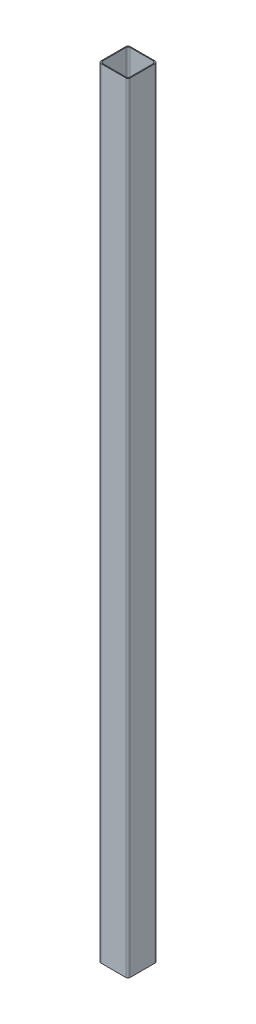
ISO-10303-21;
HEADER;
FILE_DESCRIPTION(('STEP AP214'),'2;1');
FILE_NAME('part.step','',(''),(''),'','','');
FILE_SCHEMA(('AUTOMOTIVE_DESIGN { 1 0 10303 214 1 1 1 1 }'));
ENDSEC;
DATA;
#1=APPLICATION_CONTEXT('core data for automotive mechanical design processes');
#2=APPLICATION_PROTOCOL_DEFINITION('international standard','automotive_design',2000,#1);
#3=PRODUCT_CONTEXT('',#1,'mechanical');
#4=PRODUCT('Part','Part','',(#3));
#5=PRODUCT_RELATED_PRODUCT_CATEGORY('part','',(#4));
#6=PRODUCT_DEFINITION_FORMATION('','',#4);
#7=PRODUCT_DEFINITION_CONTEXT('part definition',#1,'design');
#8=PRODUCT_DEFINITION('design','',#6,#7);
#9=PRODUCT_DEFINITION_SHAPE('','',#8);
#10=(LENGTH_UNIT() NAMED_UNIT(*) SI_UNIT(.MILLI.,.METRE.));
#11=(NAMED_UNIT(*) PLANE_ANGLE_UNIT() SI_UNIT($,.RADIAN.));
#12=(NAMED_UNIT(*) SI_UNIT($,.STERADIAN.) SOLID_ANGLE_UNIT());
#13=UNCERTAINTY_MEASURE_WITH_UNIT(LENGTH_MEASURE(1.E-05),#10,'distance_accuracy_value','');
#14=(GEOMETRIC_REPRESENTATION_CONTEXT(3) GLOBAL_UNCERTAINTY_ASSIGNED_CONTEXT((#13)) GLOBAL_UNIT_ASSIGNED_CONTEXT((#10,
#11,#12)) REPRESENTATION_CONTEXT('',''));
#15=CARTESIAN_POINT('',(0.,0.,0.));
#16=DIRECTION('',(0.,0.,1.));
#17=DIRECTION('',(1.,0.,0.));
#18=AXIS2_PLACEMENT_3D('',#15,#16,#17);
#19=CARTESIAN_POINT('',(0.,530.,0.));
#20=DIRECTION('',(0.,1.,0.));
#21=DIRECTION('',(0.,0.,1.));
#22=AXIS2_PLACEMENT_3D('',#19,#20,#21);
#23=PLANE('',#22);
#24=DIRECTION('',(-1.,0.,0.));
#25=VECTOR('',#24,1.);
#26=CARTESIAN_POINT('',(20.,530.,-20.));
#27=LINE('',#26,#25);
#28=CARTESIAN_POINT('',(17.,530.,-20.));
#29=VERTEX_POINT('',#28);
#30=CARTESIAN_POINT('',(-17.,530.,-20.));
#31=VERTEX_POINT('',#30);
#32=EDGE_CURVE('E183',#29,#31,#27,.T.);
#33=ORIENTED_EDGE('',*,*,#32,.T.);
#34=CARTESIAN_POINT('',(-17.,530.,-17.));
#35=DIRECTION('',(0.,1.,0.));
#36=DIRECTION('',(0.,0.,1.));
#37=AXIS2_PLACEMENT_3D('',#34,#35,#36);
#38=CIRCLE('',#37,3.);
#39=CARTESIAN_POINT('',(-20.,530.,-17.));
#40=VERTEX_POINT('',#39);
#41=EDGE_CURVE('E203',#31,#40,#38,.T.);
#42=ORIENTED_EDGE('',*,*,#41,.T.);
#43=DIRECTION('',(0.,0.,1.));
#44=VECTOR('',#43,1.);
#45=CARTESIAN_POINT('',(-20.,530.,20.));
#46=LINE('',#45,#44);
#47=CARTESIAN_POINT('',(-20.,530.,17.));
#48=VERTEX_POINT('',#47);
#49=EDGE_CURVE('E165',#40,#48,#46,.T.);
#50=ORIENTED_EDGE('',*,*,#49,.T.);
#51=CARTESIAN_POINT('',(-17.,530.,17.));
#52=DIRECTION('',(0.,1.,0.));
#53=DIRECTION('',(0.,0.,1.));
#54=AXIS2_PLACEMENT_3D('',#51,#52,#53);
#55=CIRCLE('',#54,3.);
#56=CARTESIAN_POINT('',(-17.,530.,20.));
#57=VERTEX_POINT('',#56);
#58=EDGE_CURVE('E199',#48,#57,#55,.T.);
#59=ORIENTED_EDGE('',*,*,#58,.T.);
#60=DIRECTION('',(1.,0.,0.));
#61=VECTOR('',#60,1.);
#62=CARTESIAN_POINT('',(20.,530.,20.));
#63=LINE('',#62,#61);
#64=CARTESIAN_POINT('',(17.,530.,20.));
#65=VERTEX_POINT('',#64);
#66=EDGE_CURVE('E275',#57,#65,#63,.T.);
#67=ORIENTED_EDGE('',*,*,#66,.T.);
#68=CARTESIAN_POINT('',(17.,530.,17.));
#69=DIRECTION('',(0.,1.,0.));
#70=DIRECTION('',(0.,0.,1.));
#71=AXIS2_PLACEMENT_3D('',#68,#69,#70);
#72=CIRCLE('',#71,3.);
#73=CARTESIAN_POINT('',(20.,530.,17.));
#74=VERTEX_POINT('',#73);
#75=EDGE_CURVE('E197',#65,#74,#72,.T.);
#76=ORIENTED_EDGE('',*,*,#75,.T.);
#77=DIRECTION('',(0.,0.,-1.));
#78=VECTOR('',#77,1.);
#79=CARTESIAN_POINT('',(20.,530.,20.));
#80=LINE('',#79,#78);
#81=CARTESIAN_POINT('',(20.,530.,-17.));
#82=VERTEX_POINT('',#81);
#83=EDGE_CURVE('E277',#74,#82,#80,.T.);
#84=ORIENTED_EDGE('',*,*,#83,.T.);
#85=CARTESIAN_POINT('',(17.,530.,-17.));
#86=DIRECTION('',(0.,1.,0.));
#87=DIRECTION('',(0.,0.,1.));
#88=AXIS2_PLACEMENT_3D('',#85,#86,#87);
#89=CIRCLE('',#88,3.);
#90=EDGE_CURVE('E201',#82,#29,#89,.T.);
#91=ORIENTED_EDGE('',*,*,#90,.T.);
#92=EDGE_LOOP('',(#33,#42,#50,#59,#67,#76,#84,#91));
#93=FACE_BOUND('',#92,.T.);
#94=DIRECTION('',(0.,0.,-1.));
#95=VECTOR('',#94,1.);
#96=CARTESIAN_POINT('',(18.8,530.,18.8));
#97=LINE('',#96,#95);
#98=CARTESIAN_POINT('',(18.8,530.,15.8));
#99=VERTEX_POINT('',#98);
#100=CARTESIAN_POINT('',(18.8,530.,-15.8));
#101=VERTEX_POINT('',#100);
#102=EDGE_CURVE('E261',#99,#101,#97,.T.);
#103=ORIENTED_EDGE('',*,*,#102,.F.);
#104=CARTESIAN_POINT('',(15.8,530.,15.8));
#105=DIRECTION('',(0.,1.,0.));
#106=DIRECTION('',(0.,0.,1.));
#107=AXIS2_PLACEMENT_3D('',#104,#105,#106);
#108=CIRCLE('',#107,3.);
#109=CARTESIAN_POINT('',(15.8,530.,18.8));
#110=VERTEX_POINT('',#109);
#111=EDGE_CURVE('E240',#99,#110,#108,.F.);
#112=ORIENTED_EDGE('',*,*,#111,.T.);
#113=DIRECTION('',(1.,0.,0.));
#114=VECTOR('',#113,1.);
#115=CARTESIAN_POINT('',(18.8,530.,18.8));
#116=LINE('',#115,#114);
#117=CARTESIAN_POINT('',(-15.8,530.,18.8));
#118=VERTEX_POINT('',#117);
#119=EDGE_CURVE('E256',#118,#110,#116,.T.);
#120=ORIENTED_EDGE('',*,*,#119,.F.);
#121=CARTESIAN_POINT('',(-15.8,530.,15.8));
#122=DIRECTION('',(0.,1.,0.));
#123=DIRECTION('',(0.,0.,1.));
#124=AXIS2_PLACEMENT_3D('',#121,#122,#123);
#125=CIRCLE('',#124,3.);
#126=CARTESIAN_POINT('',(-18.8,530.,15.8));
#127=VERTEX_POINT('',#126);
#128=EDGE_CURVE('E244',#118,#127,#125,.F.);
#129=ORIENTED_EDGE('',*,*,#128,.T.);
#130=DIRECTION('',(0.,0.,1.));
#131=VECTOR('',#130,1.);
#132=CARTESIAN_POINT('',(-18.8,530.,18.8));
#133=LINE('',#132,#131);
#134=CARTESIAN_POINT('',(-18.8,530.,-15.8));
#135=VERTEX_POINT('',#134);
#136=EDGE_CURVE('E174',#135,#127,#133,.T.);
#137=ORIENTED_EDGE('',*,*,#136,.F.);
#138=CARTESIAN_POINT('',(-15.8,530.,-15.8));
#139=DIRECTION('',(0.,1.,0.));
#140=DIRECTION('',(0.,0.,1.));
#141=AXIS2_PLACEMENT_3D('',#138,#139,#140);
#142=CIRCLE('',#141,3.);
#143=CARTESIAN_POINT('',(-15.8,530.,-18.8));
#144=VERTEX_POINT('',#143);
#145=EDGE_CURVE('E11',#135,#144,#142,.F.);
#146=ORIENTED_EDGE('',*,*,#145,.T.);
#147=DIRECTION('',(-1.,0.,0.));
#148=VECTOR('',#147,1.);
#149=CARTESIAN_POINT('',(18.8,530.,-18.8));
#150=LINE('',#149,#148);
#151=CARTESIAN_POINT('',(15.8,530.,-18.8));
#152=VERTEX_POINT('',#151);
#153=EDGE_CURVE('E180',#152,#144,#150,.T.);
#154=ORIENTED_EDGE('',*,*,#153,.F.);
#155=CARTESIAN_POINT('',(15.8,530.,-15.8));
#156=DIRECTION('',(0.,1.,0.));
#157=DIRECTION('',(0.,0.,1.));
#158=AXIS2_PLACEMENT_3D('',#155,#156,#157);
#159=CIRCLE('',#158,3.);
#160=EDGE_CURVE('E236',#152,#101,#159,.F.);
#161=ORIENTED_EDGE('',*,*,#160,.T.);
#162=EDGE_LOOP('',(#103,#112,#120,#129,#137,#146,#154,#161));
#163=FACE_BOUND('',#162,.T.);
#164=ADVANCED_FACE('F32',(#93,#163),#23,.T.);
#165=CARTESIAN_POINT('',(0.,-530.,0.));
#166=DIRECTION('',(0.,1.,0.));
#167=DIRECTION('',(0.,0.,1.));
#168=AXIS2_PLACEMENT_3D('',#165,#166,#167);
#169=PLANE('',#168);
#170=DIRECTION('',(0.,0.,1.));
#171=VECTOR('',#170,1.);
#172=CARTESIAN_POINT('',(-20.,-530.,20.));
#173=LINE('',#172,#171);
#174=CARTESIAN_POINT('',(-20.,-530.,-17.));
#175=VERTEX_POINT('',#174);
#176=CARTESIAN_POINT('',(-20.,-530.,17.));
#177=VERTEX_POINT('',#176);
#178=EDGE_CURVE('E162',#175,#177,#173,.T.);
#179=ORIENTED_EDGE('',*,*,#178,.F.);
#180=CARTESIAN_POINT('',(-17.,-530.,-17.));
#181=DIRECTION('',(0.,1.,0.));
#182=DIRECTION('',(0.,0.,1.));
#183=AXIS2_PLACEMENT_3D('',#180,#181,#182);
#184=CIRCLE('',#183,3.);
#185=CARTESIAN_POINT('',(-17.,-530.,-20.));
#186=VERTEX_POINT('',#185);
#187=EDGE_CURVE('E145',#175,#186,#184,.F.);
#188=ORIENTED_EDGE('',*,*,#187,.T.);
#189=DIRECTION('',(-1.,0.,0.));
#190=VECTOR('',#189,1.);
#191=CARTESIAN_POINT('',(20.,-530.,-20.));
#192=LINE('',#191,#190);
#193=CARTESIAN_POINT('',(17.,-530.,-20.));
#194=VERTEX_POINT('',#193);
#195=EDGE_CURVE('E188',#194,#186,#192,.T.);
#196=ORIENTED_EDGE('',*,*,#195,.F.);
#197=CARTESIAN_POINT('',(17.,-530.,-17.));
#198=DIRECTION('',(0.,1.,0.));
#199=DIRECTION('',(0.,0.,1.));
#200=AXIS2_PLACEMENT_3D('',#197,#198,#199);
#201=CIRCLE('',#200,3.);
#202=CARTESIAN_POINT('',(20.,-530.,-17.));
#203=VERTEX_POINT('',#202);
#204=EDGE_CURVE('E156',#194,#203,#201,.F.);
#205=ORIENTED_EDGE('',*,*,#204,.T.);
#206=DIRECTION('',(0.,0.,-1.));
#207=VECTOR('',#206,1.);
#208=CARTESIAN_POINT('',(20.,-530.,20.));
#209=LINE('',#208,#207);
#210=CARTESIAN_POINT('',(20.,-530.,17.));
#211=VERTEX_POINT('',#210);
#212=EDGE_CURVE('E177',#211,#203,#209,.T.);
#213=ORIENTED_EDGE('',*,*,#212,.F.);
#214=CARTESIAN_POINT('',(17.,-530.,17.));
#215=DIRECTION('',(0.,1.,0.));
#216=DIRECTION('',(0.,0.,1.));
#217=AXIS2_PLACEMENT_3D('',#214,#215,#216);
#218=CIRCLE('',#217,3.);
#219=CARTESIAN_POINT('',(17.,-530.,20.));
#220=VERTEX_POINT('',#219);
#221=EDGE_CURVE('E166',#211,#220,#218,.F.);
#222=ORIENTED_EDGE('',*,*,#221,.T.);
#223=DIRECTION('',(1.,0.,0.));
#224=VECTOR('',#223,1.);
#225=CARTESIAN_POINT('',(20.,-530.,20.));
#226=LINE('',#225,#224);
#227=CARTESIAN_POINT('',(-17.,-530.,20.));
#228=VERTEX_POINT('',#227);
#229=EDGE_CURVE('E173',#228,#220,#226,.T.);
#230=ORIENTED_EDGE('',*,*,#229,.F.);
#231=CARTESIAN_POINT('',(-17.,-530.,17.));
#232=DIRECTION('',(0.,1.,0.));
#233=DIRECTION('',(0.,0.,1.));
#234=AXIS2_PLACEMENT_3D('',#231,#232,#233);
#235=CIRCLE('',#234,3.);
#236=EDGE_CURVE('E172',#228,#177,#235,.F.);
#237=ORIENTED_EDGE('',*,*,#236,.T.);
#238=EDGE_LOOP('',(#179,#188,#196,#205,#213,#222,#230,#237));
#239=FACE_BOUND('',#238,.T.);
#240=DIRECTION('',(0.,0.,1.));
#241=VECTOR('',#240,1.);
#242=CARTESIAN_POINT('',(-18.8,-530.,18.8));
#243=LINE('',#242,#241);
#244=CARTESIAN_POINT('',(-18.8,-530.,-15.8));
#245=VERTEX_POINT('',#244);
#246=CARTESIAN_POINT('',(-18.8,-530.,15.8));
#247=VERTEX_POINT('',#246);
#248=EDGE_CURVE('E248',#245,#247,#243,.T.);
#249=ORIENTED_EDGE('',*,*,#248,.T.);
#250=CARTESIAN_POINT('',(-15.8,-530.,15.8));
#251=DIRECTION('',(0.,1.,0.));
#252=DIRECTION('',(0.,0.,1.));
#253=AXIS2_PLACEMENT_3D('',#250,#251,#252);
#254=CIRCLE('',#253,3.);
#255=CARTESIAN_POINT('',(-15.8,-530.,18.8));
#256=VERTEX_POINT('',#255);
#257=EDGE_CURVE('E242',#247,#256,#254,.T.);
#258=ORIENTED_EDGE('',*,*,#257,.T.);
#259=DIRECTION('',(1.,0.,0.));
#260=VECTOR('',#259,1.);
#261=CARTESIAN_POINT('',(18.8,-530.,18.8));
#262=LINE('',#261,#260);
#263=CARTESIAN_POINT('',(15.8,-530.,18.8));
#264=VERTEX_POINT('',#263);
#265=EDGE_CURVE('E267',#256,#264,#262,.T.);
#266=ORIENTED_EDGE('',*,*,#265,.T.);
#267=CARTESIAN_POINT('',(15.8,-530.,15.8));
#268=DIRECTION('',(0.,1.,0.));
#269=DIRECTION('',(0.,0.,1.));
#270=AXIS2_PLACEMENT_3D('',#267,#268,#269);
#271=CIRCLE('',#270,3.);
#272=CARTESIAN_POINT('',(18.8,-530.,15.8));
#273=VERTEX_POINT('',#272);
#274=EDGE_CURVE('E238',#264,#273,#271,.T.);
#275=ORIENTED_EDGE('',*,*,#274,.T.);
#276=DIRECTION('',(0.,0.,-1.));
#277=VECTOR('',#276,1.);
#278=CARTESIAN_POINT('',(18.8,-530.,18.8));
#279=LINE('',#278,#277);
#280=CARTESIAN_POINT('',(18.8,-530.,-15.8));
#281=VERTEX_POINT('',#280);
#282=EDGE_CURVE('E270',#273,#281,#279,.T.);
#283=ORIENTED_EDGE('',*,*,#282,.T.);
#284=CARTESIAN_POINT('',(15.8,-530.,-15.8));
#285=DIRECTION('',(0.,1.,0.));
#286=DIRECTION('',(0.,0.,1.));
#287=AXIS2_PLACEMENT_3D('',#284,#285,#286);
#288=CIRCLE('',#287,3.);
#289=CARTESIAN_POINT('',(15.8,-530.,-18.8));
#290=VERTEX_POINT('',#289);
#291=EDGE_CURVE('E234',#281,#290,#288,.T.);
#292=ORIENTED_EDGE('',*,*,#291,.T.);
#293=DIRECTION('',(-1.,0.,0.));
#294=VECTOR('',#293,1.);
#295=CARTESIAN_POINT('',(18.8,-530.,-18.8));
#296=LINE('',#295,#294);
#297=CARTESIAN_POINT('',(-15.8,-530.,-18.8));
#298=VERTEX_POINT('',#297);
#299=EDGE_CURVE('E249',#290,#298,#296,.T.);
#300=ORIENTED_EDGE('',*,*,#299,.T.);
#301=CARTESIAN_POINT('',(-15.8,-530.,-15.8));
#302=DIRECTION('',(0.,1.,0.));
#303=DIRECTION('',(0.,0.,1.));
#304=AXIS2_PLACEMENT_3D('',#301,#302,#303);
#305=CIRCLE('',#304,3.);
#306=EDGE_CURVE('E40',#298,#245,#305,.T.);
#307=ORIENTED_EDGE('',*,*,#306,.T.);
#308=EDGE_LOOP('',(#249,#258,#266,#275,#283,#292,#300,#307));
#309=FACE_BOUND('',#308,.T.);
#310=ADVANCED_FACE('F169',(#239,#309),#169,.F.);
#311=CARTESIAN_POINT('',(-20.,530.,20.));
#312=DIRECTION('',(1.,0.,0.));
#313=DIRECTION('',(0.,0.,-1.));
#314=AXIS2_PLACEMENT_3D('',#311,#312,#313);
#315=PLANE('',#314);
#316=ORIENTED_EDGE('',*,*,#49,.F.);
#317=DIRECTION('',(0.,-1.,0.));
#318=VECTOR('',#317,1.);
#319=CARTESIAN_POINT('',(-20.,530.,-17.));
#320=LINE('',#319,#318);
#321=EDGE_CURVE('E149',#40,#175,#320,.T.);
#322=ORIENTED_EDGE('',*,*,#321,.T.);
#323=ORIENTED_EDGE('',*,*,#178,.T.);
#324=DIRECTION('',(0.,-1.,0.));
#325=VECTOR('',#324,1.);
#326=CARTESIAN_POINT('',(-20.,530.,17.));
#327=LINE('',#326,#325);
#328=EDGE_CURVE('E167',#177,#48,#327,.F.);
#329=ORIENTED_EDGE('',*,*,#328,.T.);
#330=EDGE_LOOP('',(#316,#322,#323,#329));
#331=FACE_BOUND('',#330,.T.);
#332=ADVANCED_FACE('F161',(#331),#315,.F.);
#333=CARTESIAN_POINT('',(20.,530.,20.));
#334=DIRECTION('',(0.,0.,-1.));
#335=DIRECTION('',(-1.,0.,0.));
#336=AXIS2_PLACEMENT_3D('',#333,#334,#335);
#337=PLANE('',#336);
#338=ORIENTED_EDGE('',*,*,#66,.F.);
#339=DIRECTION('',(0.,-1.,0.));
#340=VECTOR('',#339,1.);
#341=CARTESIAN_POINT('',(-17.,530.,20.));
#342=LINE('',#341,#340);
#343=EDGE_CURVE('E231',#57,#228,#342,.T.);
#344=ORIENTED_EDGE('',*,*,#343,.T.);
#345=ORIENTED_EDGE('',*,*,#229,.T.);
#346=DIRECTION('',(0.,-1.,0.));
#347=VECTOR('',#346,1.);
#348=CARTESIAN_POINT('',(17.,530.,20.));
#349=LINE('',#348,#347);
#350=EDGE_CURVE('E229',#220,#65,#349,.F.);
#351=ORIENTED_EDGE('',*,*,#350,.T.);
#352=EDGE_LOOP('',(#338,#344,#345,#351));
#353=FACE_BOUND('',#352,.T.);
#354=ADVANCED_FACE('F299',(#353),#337,.F.);
#355=CARTESIAN_POINT('',(20.,530.,20.));
#356=DIRECTION('',(-1.,0.,0.));
#357=DIRECTION('',(0.,0.,1.));
#358=AXIS2_PLACEMENT_3D('',#355,#356,#357);
#359=PLANE('',#358);
#360=ORIENTED_EDGE('',*,*,#212,.T.);
#361=DIRECTION('',(0.,-1.,0.));
#362=VECTOR('',#361,1.);
#363=CARTESIAN_POINT('',(20.,530.,-17.));
#364=LINE('',#363,#362);
#365=EDGE_CURVE('E208',#203,#82,#364,.F.);
#366=ORIENTED_EDGE('',*,*,#365,.T.);
#367=ORIENTED_EDGE('',*,*,#83,.F.);
#368=DIRECTION('',(0.,-1.,0.));
#369=VECTOR('',#368,1.);
#370=CARTESIAN_POINT('',(20.,530.,17.));
#371=LINE('',#370,#369);
#372=EDGE_CURVE('E205',#74,#211,#371,.T.);
#373=ORIENTED_EDGE('',*,*,#372,.T.);
#374=EDGE_LOOP('',(#360,#366,#367,#373));
#375=FACE_BOUND('',#374,.T.);
#376=ADVANCED_FACE('F292',(#375),#359,.F.);
#377=CARTESIAN_POINT('',(20.,530.,-20.));
#378=DIRECTION('',(0.,0.,1.));
#379=DIRECTION('',(1.,0.,0.));
#380=AXIS2_PLACEMENT_3D('',#377,#378,#379);
#381=PLANE('',#380);
#382=ORIENTED_EDGE('',*,*,#195,.T.);
#383=DIRECTION('',(0.,-1.,0.));
#384=VECTOR('',#383,1.);
#385=CARTESIAN_POINT('',(-17.,530.,-20.));
#386=LINE('',#385,#384);
#387=EDGE_CURVE('E150',#186,#31,#386,.F.);
#388=ORIENTED_EDGE('',*,*,#387,.T.);
#389=ORIENTED_EDGE('',*,*,#32,.F.);
#390=DIRECTION('',(0.,-1.,0.));
#391=VECTOR('',#390,1.);
#392=CARTESIAN_POINT('',(17.,530.,-20.));
#393=LINE('',#392,#391);
#394=EDGE_CURVE('E155',#29,#194,#393,.T.);
#395=ORIENTED_EDGE('',*,*,#394,.T.);
#396=EDGE_LOOP('',(#382,#388,#389,#395));
#397=FACE_BOUND('',#396,.T.);
#398=ADVANCED_FACE('F286',(#397),#381,.F.);
#399=CARTESIAN_POINT('',(18.8,530.,18.8));
#400=DIRECTION('',(0.,0.,-1.));
#401=DIRECTION('',(-1.,0.,0.));
#402=AXIS2_PLACEMENT_3D('',#399,#400,#401);
#403=PLANE('',#402);
#404=ORIENTED_EDGE('',*,*,#119,.T.);
#405=DIRECTION('',(0.,-1.,0.));
#406=VECTOR('',#405,1.);
#407=CARTESIAN_POINT('',(15.8,-530.,18.8));
#408=LINE('',#407,#406);
#409=EDGE_CURVE('E221',#110,#264,#408,.T.);
#410=ORIENTED_EDGE('',*,*,#409,.T.);
#411=ORIENTED_EDGE('',*,*,#265,.F.);
#412=DIRECTION('',(0.,-1.,0.));
#413=VECTOR('',#412,1.);
#414=CARTESIAN_POINT('',(-15.8,530.,18.8));
#415=LINE('',#414,#413);
#416=EDGE_CURVE('E219',#256,#118,#415,.F.);
#417=ORIENTED_EDGE('',*,*,#416,.T.);
#418=EDGE_LOOP('',(#404,#410,#411,#417));
#419=FACE_BOUND('',#418,.T.);
#420=ADVANCED_FACE('F318',(#419),#403,.T.);
#421=CARTESIAN_POINT('',(18.8,530.,18.8));
#422=DIRECTION('',(-1.,0.,0.));
#423=DIRECTION('',(0.,0.,1.));
#424=AXIS2_PLACEMENT_3D('',#421,#422,#423);
#425=PLANE('',#424);
#426=ORIENTED_EDGE('',*,*,#102,.T.);
#427=DIRECTION('',(0.,-1.,0.));
#428=VECTOR('',#427,1.);
#429=CARTESIAN_POINT('',(18.8,-530.,-15.8));
#430=LINE('',#429,#428);
#431=EDGE_CURVE('E212',#101,#281,#430,.T.);
#432=ORIENTED_EDGE('',*,*,#431,.T.);
#433=ORIENTED_EDGE('',*,*,#282,.F.);
#434=DIRECTION('',(0.,-1.,0.));
#435=VECTOR('',#434,1.);
#436=CARTESIAN_POINT('',(18.8,530.,15.8));
#437=LINE('',#436,#435);
#438=EDGE_CURVE('E210',#273,#99,#437,.F.);
#439=ORIENTED_EDGE('',*,*,#438,.T.);
#440=EDGE_LOOP('',(#426,#432,#433,#439));
#441=FACE_BOUND('',#440,.T.);
#442=ADVANCED_FACE('F357',(#441),#425,.T.);
#443=CARTESIAN_POINT('',(18.8,530.,-18.8));
#444=DIRECTION('',(0.,0.,1.));
#445=DIRECTION('',(1.,0.,0.));
#446=AXIS2_PLACEMENT_3D('',#443,#444,#445);
#447=PLANE('',#446);
#448=ORIENTED_EDGE('',*,*,#299,.F.);
#449=DIRECTION('',(0.,-1.,0.));
#450=VECTOR('',#449,1.);
#451=CARTESIAN_POINT('',(15.8,530.,-18.8));
#452=LINE('',#451,#450);
#453=EDGE_CURVE('E52',#290,#152,#452,.F.);
#454=ORIENTED_EDGE('',*,*,#453,.T.);
#455=ORIENTED_EDGE('',*,*,#153,.T.);
#456=DIRECTION('',(0.,-1.,0.));
#457=VECTOR('',#456,1.);
#458=CARTESIAN_POINT('',(-15.8,-530.,-18.8));
#459=LINE('',#458,#457);
#460=EDGE_CURVE('E215',#144,#298,#459,.T.);
#461=ORIENTED_EDGE('',*,*,#460,.T.);
#462=EDGE_LOOP('',(#448,#454,#455,#461));
#463=FACE_BOUND('',#462,.T.);
#464=ADVANCED_FACE('F259',(#463),#447,.T.);
#465=CARTESIAN_POINT('',(-18.8,530.,18.8));
#466=DIRECTION('',(1.,0.,0.));
#467=DIRECTION('',(0.,0.,-1.));
#468=AXIS2_PLACEMENT_3D('',#465,#466,#467);
#469=PLANE('',#468);
#470=ORIENTED_EDGE('',*,*,#136,.T.);
#471=DIRECTION('',(0.,-1.,0.));
#472=VECTOR('',#471,1.);
#473=CARTESIAN_POINT('',(-18.8,-530.,15.8));
#474=LINE('',#473,#472);
#475=EDGE_CURVE('E226',#127,#247,#474,.T.);
#476=ORIENTED_EDGE('',*,*,#475,.T.);
#477=ORIENTED_EDGE('',*,*,#248,.F.);
#478=DIRECTION('',(0.,-1.,0.));
#479=VECTOR('',#478,1.);
#480=CARTESIAN_POINT('',(-18.8,530.,-15.8));
#481=LINE('',#480,#479);
#482=EDGE_CURVE('E224',#245,#135,#481,.F.);
#483=ORIENTED_EDGE('',*,*,#482,.T.);
#484=EDGE_LOOP('',(#470,#476,#477,#483));
#485=FACE_BOUND('',#484,.T.);
#486=ADVANCED_FACE('F254',(#485),#469,.T.);
#487=CARTESIAN_POINT('',(-17.,530.,-17.));
#488=DIRECTION('',(0.,-1.,0.));
#489=DIRECTION('',(0.,0.,-1.));
#490=AXIS2_PLACEMENT_3D('',#487,#488,#489);
#491=CYLINDRICAL_SURFACE('',#490,3.);
#492=ORIENTED_EDGE('',*,*,#41,.F.);
#493=ORIENTED_EDGE('',*,*,#387,.F.);
#494=ORIENTED_EDGE('',*,*,#187,.F.);
#495=ORIENTED_EDGE('',*,*,#321,.F.);
#496=EDGE_LOOP('',(#492,#493,#494,#495));
#497=FACE_BOUND('',#496,.T.);
#498=ADVANCED_FACE('F148',(#497),#491,.T.);
#499=CARTESIAN_POINT('',(17.,530.,-17.));
#500=DIRECTION('',(0.,-1.,0.));
#501=DIRECTION('',(0.,0.,-1.));
#502=AXIS2_PLACEMENT_3D('',#499,#500,#501);
#503=CYLINDRICAL_SURFACE('',#502,3.);
#504=ORIENTED_EDGE('',*,*,#90,.F.);
#505=ORIENTED_EDGE('',*,*,#365,.F.);
#506=ORIENTED_EDGE('',*,*,#204,.F.);
#507=ORIENTED_EDGE('',*,*,#394,.F.);
#508=EDGE_LOOP('',(#504,#505,#506,#507));
#509=FACE_BOUND('',#508,.T.);
#510=ADVANCED_FACE('F288',(#509),#503,.T.);
#511=CARTESIAN_POINT('',(15.8,530.,-15.8));
#512=DIRECTION('',(0.,1.,0.));
#513=DIRECTION('',(0.,0.,1.));
#514=AXIS2_PLACEMENT_3D('',#511,#512,#513);
#515=CYLINDRICAL_SURFACE('',#514,3.);
#516=ORIENTED_EDGE('',*,*,#160,.F.);
#517=ORIENTED_EDGE('',*,*,#453,.F.);
#518=ORIENTED_EDGE('',*,*,#291,.F.);
#519=ORIENTED_EDGE('',*,*,#431,.F.);
#520=EDGE_LOOP('',(#516,#517,#518,#519));
#521=FACE_BOUND('',#520,.T.);
#522=ADVANCED_FACE('F333',(#521),#515,.F.);
#523=CARTESIAN_POINT('',(15.8,530.,15.8));
#524=DIRECTION('',(0.,1.,0.));
#525=DIRECTION('',(0.,0.,1.));
#526=AXIS2_PLACEMENT_3D('',#523,#524,#525);
#527=CYLINDRICAL_SURFACE('',#526,3.);
#528=ORIENTED_EDGE('',*,*,#111,.F.);
#529=ORIENTED_EDGE('',*,*,#438,.F.);
#530=ORIENTED_EDGE('',*,*,#274,.F.);
#531=ORIENTED_EDGE('',*,*,#409,.F.);
#532=EDGE_LOOP('',(#528,#529,#530,#531));
#533=FACE_BOUND('',#532,.T.);
#534=ADVANCED_FACE('F336',(#533),#527,.F.);
#535=CARTESIAN_POINT('',(-15.8,530.,15.8));
#536=DIRECTION('',(0.,1.,0.));
#537=DIRECTION('',(0.,0.,1.));
#538=AXIS2_PLACEMENT_3D('',#535,#536,#537);
#539=CYLINDRICAL_SURFACE('',#538,3.);
#540=ORIENTED_EDGE('',*,*,#128,.F.);
#541=ORIENTED_EDGE('',*,*,#416,.F.);
#542=ORIENTED_EDGE('',*,*,#257,.F.);
#543=ORIENTED_EDGE('',*,*,#475,.F.);
#544=EDGE_LOOP('',(#540,#541,#542,#543));
#545=FACE_BOUND('',#544,.T.);
#546=ADVANCED_FACE('F309',(#545),#539,.F.);
#547=CARTESIAN_POINT('',(-15.8,530.,-15.8));
#548=DIRECTION('',(0.,1.,0.));
#549=DIRECTION('',(0.,0.,1.));
#550=AXIS2_PLACEMENT_3D('',#547,#548,#549);
#551=CYLINDRICAL_SURFACE('',#550,3.);
#552=ORIENTED_EDGE('',*,*,#145,.F.);
#553=ORIENTED_EDGE('',*,*,#482,.F.);
#554=ORIENTED_EDGE('',*,*,#306,.F.);
#555=ORIENTED_EDGE('',*,*,#460,.F.);
#556=EDGE_LOOP('',(#552,#553,#554,#555));
#557=FACE_BOUND('',#556,.T.);
#558=ADVANCED_FACE('F258',(#557),#551,.F.);
#559=CARTESIAN_POINT('',(-17.,530.,17.));
#560=DIRECTION('',(0.,-1.,0.));
#561=DIRECTION('',(0.,0.,-1.));
#562=AXIS2_PLACEMENT_3D('',#559,#560,#561);
#563=CYLINDRICAL_SURFACE('',#562,3.);
#564=ORIENTED_EDGE('',*,*,#58,.F.);
#565=ORIENTED_EDGE('',*,*,#328,.F.);
#566=ORIENTED_EDGE('',*,*,#236,.F.);
#567=ORIENTED_EDGE('',*,*,#343,.F.);
#568=EDGE_LOOP('',(#564,#565,#566,#567));
#569=FACE_BOUND('',#568,.T.);
#570=ADVANCED_FACE('F303',(#569),#563,.T.);
#571=CARTESIAN_POINT('',(17.,530.,17.));
#572=DIRECTION('',(0.,-1.,0.));
#573=DIRECTION('',(0.,0.,-1.));
#574=AXIS2_PLACEMENT_3D('',#571,#572,#573);
#575=CYLINDRICAL_SURFACE('',#574,3.);
#576=ORIENTED_EDGE('',*,*,#75,.F.);
#577=ORIENTED_EDGE('',*,*,#350,.F.);
#578=ORIENTED_EDGE('',*,*,#221,.F.);
#579=ORIENTED_EDGE('',*,*,#372,.F.);
#580=EDGE_LOOP('',(#576,#577,#578,#579));
#581=FACE_BOUND('',#580,.T.);
#582=ADVANCED_FACE('F34',(#581),#575,.T.);
#583=CLOSED_SHELL('',(#164,#310,#332,#354,#376,#398,#420,#442,#464,#486,#498,#510,#522,#534,
#546,#558,#570,#582));
#584=MANIFOLD_SOLID_BREP('B2',#583);
#585=ADVANCED_BREP_SHAPE_REPRESENTATION('',(#18,#584),#14);
#586=SHAPE_DEFINITION_REPRESENTATION(#9,#585);
ENDSEC;
END-ISO-10303-21;
